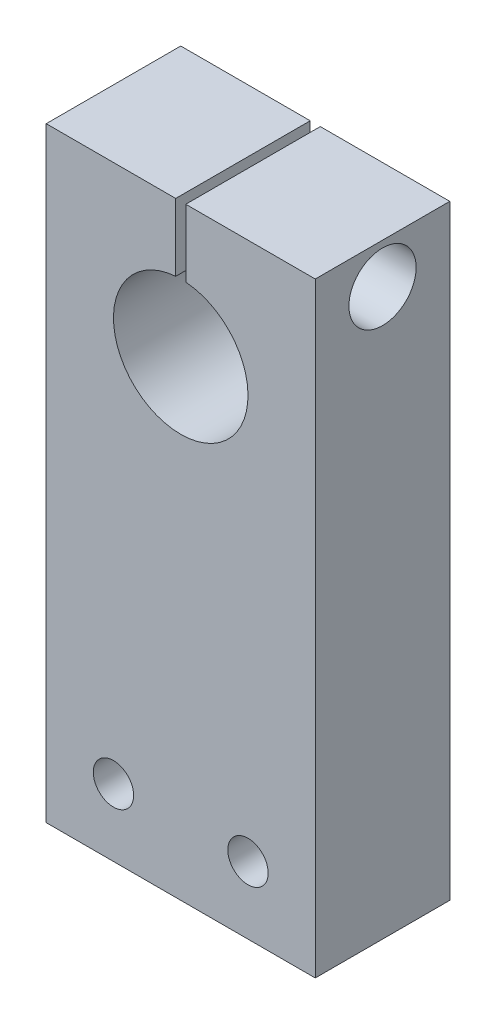
ISO-10303-21;
HEADER;
FILE_DESCRIPTION(('STEP AP214'),'2;1');
FILE_NAME('part.step','',(''),(''),'','','');
FILE_SCHEMA(('AUTOMOTIVE_DESIGN { 1 0 10303 214 1 1 1 1 }'));
ENDSEC;
DATA;
#1=APPLICATION_CONTEXT('core data for automotive mechanical design processes');
#2=APPLICATION_PROTOCOL_DEFINITION('international standard','automotive_design',2000,#1);
#3=PRODUCT_CONTEXT('',#1,'mechanical');
#4=PRODUCT('Part','Part','',(#3));
#5=PRODUCT_RELATED_PRODUCT_CATEGORY('part','',(#4));
#6=PRODUCT_DEFINITION_FORMATION('','',#4);
#7=PRODUCT_DEFINITION_CONTEXT('part definition',#1,'design');
#8=PRODUCT_DEFINITION('design','',#6,#7);
#9=PRODUCT_DEFINITION_SHAPE('','',#8);
#10=(LENGTH_UNIT() NAMED_UNIT(*) SI_UNIT(.MILLI.,.METRE.));
#11=(NAMED_UNIT(*) PLANE_ANGLE_UNIT() SI_UNIT($,.RADIAN.));
#12=(NAMED_UNIT(*) SI_UNIT($,.STERADIAN.) SOLID_ANGLE_UNIT());
#13=UNCERTAINTY_MEASURE_WITH_UNIT(LENGTH_MEASURE(1.E-05),#10,'distance_accuracy_value','');
#14=(GEOMETRIC_REPRESENTATION_CONTEXT(3) GLOBAL_UNCERTAINTY_ASSIGNED_CONTEXT((#13)) GLOBAL_UNIT_ASSIGNED_CONTEXT((#10,
#11,#12)) REPRESENTATION_CONTEXT('',''));
#15=CARTESIAN_POINT('',(0.,0.,0.));
#16=DIRECTION('',(0.,0.,1.));
#17=DIRECTION('',(1.,0.,0.));
#18=AXIS2_PLACEMENT_3D('',#15,#16,#17);
#19=CARTESIAN_POINT('',(-9.99999999999999,39.,10.));
#20=DIRECTION('',(1.,0.,0.));
#21=DIRECTION('',(0.,0.,-1.));
#22=AXIS2_PLACEMENT_3D('',#19,#20,#21);
#23=CYLINDRICAL_SURFACE('',#22,3.);
#24=CARTESIAN_POINT('',(0.750000000000001,39.,10.));
#25=DIRECTION('',(1.,0.,0.));
#26=DIRECTION('',(0.,1.,0.));
#27=AXIS2_PLACEMENT_3D('',#24,#25,#26);
#28=CIRCLE('',#27,3.);
#29=CARTESIAN_POINT('',(0.750000000000001,42.,10.));
#30=VERTEX_POINT('',#29);
#31=EDGE_CURVE('E141',#30,#30,#28,.T.);
#32=ORIENTED_EDGE('',*,*,#31,.F.);
#33=EDGE_LOOP('',(#32));
#34=FACE_BOUND('',#33,.T.);
#35=CARTESIAN_POINT('',(10.,39.,10.));
#36=DIRECTION('',(1.,0.,0.));
#37=DIRECTION('',(0.,0.,-1.));
#38=AXIS2_PLACEMENT_3D('',#35,#36,#37);
#39=CIRCLE('',#38,3.);
#40=CARTESIAN_POINT('',(10.,39.,7.));
#41=VERTEX_POINT('',#40);
#42=EDGE_CURVE('E39',#41,#41,#39,.F.);
#43=ORIENTED_EDGE('',*,*,#42,.F.);
#44=EDGE_LOOP('',(#43));
#45=FACE_BOUND('',#44,.T.);
#46=ADVANCED_FACE('F35',(#34,#45),#23,.F.);
#47=CARTESIAN_POINT('',(0.,25.,20.));
#48=DIRECTION('',(0.,0.,-1.));
#49=DIRECTION('',(-1.,0.,0.));
#50=AXIS2_PLACEMENT_3D('',#47,#48,#49);
#51=CYLINDRICAL_SURFACE('',#50,10.);
#52=CARTESIAN_POINT('',(0.,25.,0.));
#53=DIRECTION('',(0.,0.,1.));
#54=DIRECTION('',(1.,0.,0.));
#55=AXIS2_PLACEMENT_3D('',#52,#53,#54);
#56=CIRCLE('',#55,10.);
#57=CARTESIAN_POINT('',(-0.75,34.9718353375896,0.));
#58=VERTEX_POINT('',#57);
#59=CARTESIAN_POINT('',(0.75,34.9718353375896,0.));
#60=VERTEX_POINT('',#59);
#61=EDGE_CURVE('E183',#58,#60,#56,.T.);
#62=ORIENTED_EDGE('',*,*,#61,.F.);
#63=DIRECTION('',(0.,0.,-1.));
#64=VECTOR('',#63,1.);
#65=CARTESIAN_POINT('',(-0.75,34.9718353375896,20.));
#66=LINE('',#65,#64);
#67=CARTESIAN_POINT('',(-0.75,34.9718353375896,20.));
#68=VERTEX_POINT('',#67);
#69=EDGE_CURVE('E11',#68,#58,#66,.T.);
#70=ORIENTED_EDGE('',*,*,#69,.F.);
#71=CARTESIAN_POINT('',(0.,25.,20.));
#72=DIRECTION('',(0.,0.,1.));
#73=DIRECTION('',(1.,0.,0.));
#74=AXIS2_PLACEMENT_3D('',#71,#72,#73);
#75=CIRCLE('',#74,10.);
#76=CARTESIAN_POINT('',(0.75,34.9718353375896,20.));
#77=VERTEX_POINT('',#76);
#78=EDGE_CURVE('E166',#68,#77,#75,.T.);
#79=ORIENTED_EDGE('',*,*,#78,.T.);
#80=DIRECTION('',(0.,0.,-1.));
#81=VECTOR('',#80,1.);
#82=CARTESIAN_POINT('',(0.75,34.9718353375896,20.));
#83=LINE('',#82,#81);
#84=EDGE_CURVE('E88',#77,#60,#83,.T.);
#85=ORIENTED_EDGE('',*,*,#84,.T.);
#86=EDGE_LOOP('',(#62,#70,#79,#85));
#87=FACE_BOUND('',#86,.T.);
#88=ADVANCED_FACE('F204',(#87),#51,.F.);
#89=CARTESIAN_POINT('',(-0.749999999999999,0.,20.));
#90=DIRECTION('',(-1.,0.,0.));
#91=DIRECTION('',(0.,-1.,0.));
#92=AXIS2_PLACEMENT_3D('',#89,#90,#91);
#93=PLANE('',#92);
#94=CARTESIAN_POINT('',(-0.750000000000001,39.,10.));
#95=DIRECTION('',(-1.,0.,0.));
#96=DIRECTION('',(0.,-1.,0.));
#97=AXIS2_PLACEMENT_3D('',#94,#95,#96);
#98=CIRCLE('',#97,3.);
#99=CARTESIAN_POINT('',(-0.750000000000001,36.,10.));
#100=VERTEX_POINT('',#99);
#101=EDGE_CURVE('E143',#100,#100,#98,.T.);
#102=ORIENTED_EDGE('',*,*,#101,.T.);
#103=EDGE_LOOP('',(#102));
#104=FACE_BOUND('',#103,.T.);
#105=DIRECTION('',(0.,1.,0.));
#106=VECTOR('',#105,1.);
#107=CARTESIAN_POINT('',(-0.749999999999999,0.,0.));
#108=LINE('',#107,#106);
#109=CARTESIAN_POINT('',(-0.75,45.,0.));
#110=VERTEX_POINT('',#109);
#111=EDGE_CURVE('E185',#58,#110,#108,.T.);
#112=ORIENTED_EDGE('',*,*,#111,.T.);
#113=DIRECTION('',(0.,0.,-1.));
#114=VECTOR('',#113,1.);
#115=CARTESIAN_POINT('',(-0.75,45.,20.));
#116=LINE('',#115,#114);
#117=CARTESIAN_POINT('',(-0.75,45.,20.));
#118=VERTEX_POINT('',#117);
#119=EDGE_CURVE('E45',#118,#110,#116,.T.);
#120=ORIENTED_EDGE('',*,*,#119,.F.);
#121=DIRECTION('',(0.,1.,0.));
#122=VECTOR('',#121,1.);
#123=CARTESIAN_POINT('',(-0.749999999999999,0.,20.));
#124=LINE('',#123,#122);
#125=EDGE_CURVE('E168',#68,#118,#124,.T.);
#126=ORIENTED_EDGE('',*,*,#125,.F.);
#127=ORIENTED_EDGE('',*,*,#69,.T.);
#128=EDGE_LOOP('',(#112,#120,#126,#127));
#129=FACE_BOUND('',#128,.T.);
#130=ADVANCED_FACE('F206',(#104,#129),#93,.F.);
#131=CARTESIAN_POINT('',(0.,45.,20.));
#132=DIRECTION('',(0.,-1.,0.));
#133=DIRECTION('',(0.,0.,-1.));
#134=AXIS2_PLACEMENT_3D('',#131,#132,#133);
#135=PLANE('',#134);
#136=DIRECTION('',(-1.,0.,0.));
#137=VECTOR('',#136,1.);
#138=CARTESIAN_POINT('',(0.,45.,0.));
#139=LINE('',#138,#137);
#140=CARTESIAN_POINT('',(-20.,45.,0.));
#141=VERTEX_POINT('',#140);
#142=EDGE_CURVE('E188',#110,#141,#139,.T.);
#143=ORIENTED_EDGE('',*,*,#142,.T.);
#144=DIRECTION('',(0.,0.,-1.));
#145=VECTOR('',#144,1.);
#146=CARTESIAN_POINT('',(-20.,45.,20.));
#147=LINE('',#146,#145);
#148=CARTESIAN_POINT('',(-20.,45.,20.));
#149=VERTEX_POINT('',#148);
#150=EDGE_CURVE('E137',#149,#141,#147,.T.);
#151=ORIENTED_EDGE('',*,*,#150,.F.);
#152=DIRECTION('',(-1.,0.,0.));
#153=VECTOR('',#152,1.);
#154=CARTESIAN_POINT('',(0.,45.,20.));
#155=LINE('',#154,#153);
#156=EDGE_CURVE('E171',#118,#149,#155,.T.);
#157=ORIENTED_EDGE('',*,*,#156,.F.);
#158=ORIENTED_EDGE('',*,*,#119,.T.);
#159=EDGE_LOOP('',(#143,#151,#157,#158));
#160=FACE_BOUND('',#159,.T.);
#161=ADVANCED_FACE('F212',(#160),#135,.F.);
#162=CARTESIAN_POINT('',(-20.,0.,20.));
#163=DIRECTION('',(1.,0.,0.));
#164=DIRECTION('',(0.,0.,-1.));
#165=AXIS2_PLACEMENT_3D('',#162,#163,#164);
#166=PLANE('',#165);
#167=DIRECTION('',(0.,-1.,0.));
#168=VECTOR('',#167,1.);
#169=CARTESIAN_POINT('',(-20.,0.,0.));
#170=LINE('',#169,#168);
#171=CARTESIAN_POINT('',(-20.,-45.,0.));
#172=VERTEX_POINT('',#171);
#173=EDGE_CURVE('E191',#141,#172,#170,.T.);
#174=ORIENTED_EDGE('',*,*,#173,.T.);
#175=DIRECTION('',(0.,0.,-1.));
#176=VECTOR('',#175,1.);
#177=CARTESIAN_POINT('',(-20.,-45.,20.));
#178=LINE('',#177,#176);
#179=CARTESIAN_POINT('',(-20.,-45.,20.));
#180=VERTEX_POINT('',#179);
#181=EDGE_CURVE('E130',#180,#172,#178,.T.);
#182=ORIENTED_EDGE('',*,*,#181,.F.);
#183=DIRECTION('',(0.,-1.,0.));
#184=VECTOR('',#183,1.);
#185=CARTESIAN_POINT('',(-20.,0.,20.));
#186=LINE('',#185,#184);
#187=EDGE_CURVE('E174',#149,#180,#186,.T.);
#188=ORIENTED_EDGE('',*,*,#187,.F.);
#189=ORIENTED_EDGE('',*,*,#150,.T.);
#190=EDGE_LOOP('',(#174,#182,#188,#189));
#191=FACE_BOUND('',#190,.T.);
#192=ADVANCED_FACE('F252',(#191),#166,.F.);
#193=CARTESIAN_POINT('',(0.,-45.,20.));
#194=DIRECTION('',(0.,1.,0.));
#195=DIRECTION('',(0.,0.,1.));
#196=AXIS2_PLACEMENT_3D('',#193,#194,#195);
#197=PLANE('',#196);
#198=DIRECTION('',(1.,0.,0.));
#199=VECTOR('',#198,1.);
#200=CARTESIAN_POINT('',(0.,-45.,0.));
#201=LINE('',#200,#199);
#202=CARTESIAN_POINT('',(20.,-45.,0.));
#203=VERTEX_POINT('',#202);
#204=EDGE_CURVE('E194',#172,#203,#201,.T.);
#205=ORIENTED_EDGE('',*,*,#204,.T.);
#206=DIRECTION('',(0.,0.,-1.));
#207=VECTOR('',#206,1.);
#208=CARTESIAN_POINT('',(20.,-45.,20.));
#209=LINE('',#208,#207);
#210=CARTESIAN_POINT('',(20.,-45.,20.));
#211=VERTEX_POINT('',#210);
#212=EDGE_CURVE('E128',#211,#203,#209,.T.);
#213=ORIENTED_EDGE('',*,*,#212,.F.);
#214=DIRECTION('',(1.,0.,0.));
#215=VECTOR('',#214,1.);
#216=CARTESIAN_POINT('',(0.,-45.,20.));
#217=LINE('',#216,#215);
#218=EDGE_CURVE('E121',#180,#211,#217,.T.);
#219=ORIENTED_EDGE('',*,*,#218,.F.);
#220=ORIENTED_EDGE('',*,*,#181,.T.);
#221=EDGE_LOOP('',(#205,#213,#219,#220));
#222=FACE_BOUND('',#221,.T.);
#223=ADVANCED_FACE('F248',(#222),#197,.F.);
#224=CARTESIAN_POINT('',(20.,0.,20.));
#225=DIRECTION('',(-1.,0.,0.));
#226=DIRECTION('',(0.,0.,1.));
#227=AXIS2_PLACEMENT_3D('',#224,#225,#226);
#228=PLANE('',#227);
#229=CARTESIAN_POINT('',(20.,39.,10.));
#230=DIRECTION('',(1.,0.,0.));
#231=DIRECTION('',(0.,0.,-1.));
#232=AXIS2_PLACEMENT_3D('',#229,#230,#231);
#233=CIRCLE('',#232,5.);
#234=CARTESIAN_POINT('',(20.,39.,5.));
#235=VERTEX_POINT('',#234);
#236=EDGE_CURVE('E157',#235,#235,#233,.T.);
#237=ORIENTED_EDGE('',*,*,#236,.F.);
#238=EDGE_LOOP('',(#237));
#239=FACE_BOUND('',#238,.T.);
#240=DIRECTION('',(0.,1.,0.));
#241=VECTOR('',#240,1.);
#242=CARTESIAN_POINT('',(20.,0.,0.));
#243=LINE('',#242,#241);
#244=CARTESIAN_POINT('',(20.,45.,0.));
#245=VERTEX_POINT('',#244);
#246=EDGE_CURVE('E127',#203,#245,#243,.T.);
#247=ORIENTED_EDGE('',*,*,#246,.T.);
#248=DIRECTION('',(0.,0.,-1.));
#249=VECTOR('',#248,1.);
#250=CARTESIAN_POINT('',(20.,45.,20.));
#251=LINE('',#250,#249);
#252=CARTESIAN_POINT('',(20.,45.,20.));
#253=VERTEX_POINT('',#252);
#254=EDGE_CURVE('E113',#253,#245,#251,.T.);
#255=ORIENTED_EDGE('',*,*,#254,.F.);
#256=DIRECTION('',(0.,1.,0.));
#257=VECTOR('',#256,1.);
#258=CARTESIAN_POINT('',(20.,0.,20.));
#259=LINE('',#258,#257);
#260=EDGE_CURVE('E116',#211,#253,#259,.T.);
#261=ORIENTED_EDGE('',*,*,#260,.F.);
#262=ORIENTED_EDGE('',*,*,#212,.T.);
#263=EDGE_LOOP('',(#247,#255,#261,#262));
#264=FACE_BOUND('',#263,.T.);
#265=ADVANCED_FACE('F126',(#239,#264),#228,.F.);
#266=CARTESIAN_POINT('',(0.,45.,20.));
#267=DIRECTION('',(0.,-1.,0.));
#268=DIRECTION('',(0.,0.,-1.));
#269=AXIS2_PLACEMENT_3D('',#266,#267,#268);
#270=PLANE('',#269);
#271=DIRECTION('',(-1.,0.,0.));
#272=VECTOR('',#271,1.);
#273=CARTESIAN_POINT('',(0.,45.,0.));
#274=LINE('',#273,#272);
#275=CARTESIAN_POINT('',(0.75,45.,0.));
#276=VERTEX_POINT('',#275);
#277=EDGE_CURVE('E198',#245,#276,#274,.T.);
#278=ORIENTED_EDGE('',*,*,#277,.T.);
#279=DIRECTION('',(0.,0.,-1.));
#280=VECTOR('',#279,1.);
#281=CARTESIAN_POINT('',(0.75,45.,20.));
#282=LINE('',#281,#280);
#283=CARTESIAN_POINT('',(0.75,45.,20.));
#284=VERTEX_POINT('',#283);
#285=EDGE_CURVE('E115',#284,#276,#282,.T.);
#286=ORIENTED_EDGE('',*,*,#285,.F.);
#287=DIRECTION('',(-1.,0.,0.));
#288=VECTOR('',#287,1.);
#289=CARTESIAN_POINT('',(0.,45.,20.));
#290=LINE('',#289,#288);
#291=EDGE_CURVE('E108',#253,#284,#290,.T.);
#292=ORIENTED_EDGE('',*,*,#291,.F.);
#293=ORIENTED_EDGE('',*,*,#254,.T.);
#294=EDGE_LOOP('',(#278,#286,#292,#293));
#295=FACE_BOUND('',#294,.T.);
#296=ADVANCED_FACE('F111',(#295),#270,.F.);
#297=CARTESIAN_POINT('',(-10.,-35.,20.));
#298=DIRECTION('',(0.,0.,-1.));
#299=DIRECTION('',(-1.,0.,0.));
#300=AXIS2_PLACEMENT_3D('',#297,#298,#299);
#301=CYLINDRICAL_SURFACE('',#300,3.);
#302=CARTESIAN_POINT('',(-10.,-35.,20.));
#303=DIRECTION('',(0.,0.,1.));
#304=DIRECTION('',(1.,0.,0.));
#305=AXIS2_PLACEMENT_3D('',#302,#303,#304);
#306=CIRCLE('',#305,3.);
#307=CARTESIAN_POINT('',(-7.,-35.,20.));
#308=VERTEX_POINT('',#307);
#309=EDGE_CURVE('E163',#308,#308,#306,.T.);
#310=ORIENTED_EDGE('',*,*,#309,.T.);
#311=EDGE_LOOP('',(#310));
#312=FACE_BOUND('',#311,.T.);
#313=CARTESIAN_POINT('',(-10.,-35.,0.));
#314=DIRECTION('',(0.,0.,1.));
#315=DIRECTION('',(1.,0.,0.));
#316=AXIS2_PLACEMENT_3D('',#313,#314,#315);
#317=CIRCLE('',#316,3.);
#318=CARTESIAN_POINT('',(-7.,-35.,0.));
#319=VERTEX_POINT('',#318);
#320=EDGE_CURVE('E180',#319,#319,#317,.T.);
#321=ORIENTED_EDGE('',*,*,#320,.F.);
#322=EDGE_LOOP('',(#321));
#323=FACE_BOUND('',#322,.T.);
#324=ADVANCED_FACE('F219',(#312,#323),#301,.F.);
#325=CARTESIAN_POINT('',(10.,-35.,20.));
#326=DIRECTION('',(0.,0.,-1.));
#327=DIRECTION('',(-1.,0.,0.));
#328=AXIS2_PLACEMENT_3D('',#325,#326,#327);
#329=CYLINDRICAL_SURFACE('',#328,3.);
#330=CARTESIAN_POINT('',(10.,-35.,20.));
#331=DIRECTION('',(0.,0.,1.));
#332=DIRECTION('',(1.,0.,0.));
#333=AXIS2_PLACEMENT_3D('',#330,#331,#332);
#334=CIRCLE('',#333,3.);
#335=CARTESIAN_POINT('',(13.,-35.,20.));
#336=VERTEX_POINT('',#335);
#337=EDGE_CURVE('E160',#336,#336,#334,.T.);
#338=ORIENTED_EDGE('',*,*,#337,.T.);
#339=EDGE_LOOP('',(#338));
#340=FACE_BOUND('',#339,.T.);
#341=CARTESIAN_POINT('',(10.,-35.,0.));
#342=DIRECTION('',(0.,0.,1.));
#343=DIRECTION('',(1.,0.,0.));
#344=AXIS2_PLACEMENT_3D('',#341,#342,#343);
#345=CIRCLE('',#344,3.);
#346=CARTESIAN_POINT('',(13.,-35.,0.));
#347=VERTEX_POINT('',#346);
#348=EDGE_CURVE('E148',#347,#347,#345,.T.);
#349=ORIENTED_EDGE('',*,*,#348,.F.);
#350=EDGE_LOOP('',(#349));
#351=FACE_BOUND('',#350,.T.);
#352=ADVANCED_FACE('F37',(#340,#351),#329,.F.);
#353=CARTESIAN_POINT('',(0.749999999999999,0.,20.));
#354=DIRECTION('',(1.,0.,0.));
#355=DIRECTION('',(0.,1.,0.));
#356=AXIS2_PLACEMENT_3D('',#353,#354,#355);
#357=PLANE('',#356);
#358=ORIENTED_EDGE('',*,*,#31,.T.);
#359=EDGE_LOOP('',(#358));
#360=FACE_BOUND('',#359,.T.);
#361=DIRECTION('',(0.,-1.,0.));
#362=VECTOR('',#361,1.);
#363=CARTESIAN_POINT('',(0.749999999999999,0.,0.));
#364=LINE('',#363,#362);
#365=EDGE_CURVE('E81',#276,#60,#364,.T.);
#366=ORIENTED_EDGE('',*,*,#365,.T.);
#367=ORIENTED_EDGE('',*,*,#84,.F.);
#368=DIRECTION('',(0.,-1.,0.));
#369=VECTOR('',#368,1.);
#370=CARTESIAN_POINT('',(0.749999999999999,0.,20.));
#371=LINE('',#370,#369);
#372=EDGE_CURVE('E54',#284,#77,#371,.T.);
#373=ORIENTED_EDGE('',*,*,#372,.F.);
#374=ORIENTED_EDGE('',*,*,#285,.T.);
#375=EDGE_LOOP('',(#366,#367,#373,#374));
#376=FACE_BOUND('',#375,.T.);
#377=ADVANCED_FACE('F201',(#360,#376),#357,.F.);
#378=CARTESIAN_POINT('',(0.,0.,20.));
#379=DIRECTION('',(0.,0.,1.));
#380=DIRECTION('',(1.,0.,0.));
#381=AXIS2_PLACEMENT_3D('',#378,#379,#380);
#382=PLANE('',#381);
#383=ORIENTED_EDGE('',*,*,#337,.F.);
#384=EDGE_LOOP('',(#383));
#385=FACE_BOUND('',#384,.T.);
#386=ORIENTED_EDGE('',*,*,#309,.F.);
#387=EDGE_LOOP('',(#386));
#388=FACE_BOUND('',#387,.T.);
#389=ORIENTED_EDGE('',*,*,#78,.F.);
#390=ORIENTED_EDGE('',*,*,#125,.T.);
#391=ORIENTED_EDGE('',*,*,#156,.T.);
#392=ORIENTED_EDGE('',*,*,#187,.T.);
#393=ORIENTED_EDGE('',*,*,#218,.T.);
#394=ORIENTED_EDGE('',*,*,#260,.T.);
#395=ORIENTED_EDGE('',*,*,#291,.T.);
#396=ORIENTED_EDGE('',*,*,#372,.T.);
#397=EDGE_LOOP('',(#389,#390,#391,#392,#393,#394,#395,#396));
#398=FACE_BOUND('',#397,.T.);
#399=ADVANCED_FACE('F119',(#385,#388,#398),#382,.T.);
#400=CARTESIAN_POINT('',(0.,0.,0.));
#401=DIRECTION('',(0.,0.,1.));
#402=DIRECTION('',(1.,0.,0.));
#403=AXIS2_PLACEMENT_3D('',#400,#401,#402);
#404=PLANE('',#403);
#405=ORIENTED_EDGE('',*,*,#348,.T.);
#406=EDGE_LOOP('',(#405));
#407=FACE_BOUND('',#406,.T.);
#408=ORIENTED_EDGE('',*,*,#320,.T.);
#409=EDGE_LOOP('',(#408));
#410=FACE_BOUND('',#409,.T.);
#411=ORIENTED_EDGE('',*,*,#61,.T.);
#412=ORIENTED_EDGE('',*,*,#365,.F.);
#413=ORIENTED_EDGE('',*,*,#277,.F.);
#414=ORIENTED_EDGE('',*,*,#246,.F.);
#415=ORIENTED_EDGE('',*,*,#204,.F.);
#416=ORIENTED_EDGE('',*,*,#173,.F.);
#417=ORIENTED_EDGE('',*,*,#142,.F.);
#418=ORIENTED_EDGE('',*,*,#111,.F.);
#419=EDGE_LOOP('',(#411,#412,#413,#414,#415,#416,#417,#418));
#420=FACE_BOUND('',#419,.T.);
#421=ADVANCED_FACE('F203',(#407,#410,#420),#404,.F.);
#422=CARTESIAN_POINT('',(-9.99999999999999,39.,10.));
#423=DIRECTION('',(1.,0.,0.));
#424=DIRECTION('',(0.,0.,-1.));
#425=AXIS2_PLACEMENT_3D('',#422,#423,#424);
#426=CIRCLE('',#425,3.);
#427=CARTESIAN_POINT('',(-9.99999999999999,39.,7.));
#428=VERTEX_POINT('',#427);
#429=EDGE_CURVE('E144',#428,#428,#426,.T.);
#430=ORIENTED_EDGE('',*,*,#429,.F.);
#431=EDGE_LOOP('',(#430));
#432=FACE_BOUND('',#431,.T.);
#433=ORIENTED_EDGE('',*,*,#101,.F.);
#434=EDGE_LOOP('',(#433));
#435=FACE_BOUND('',#434,.T.);
#436=ADVANCED_FACE('F217',(#432,#435),#23,.F.);
#437=CARTESIAN_POINT('',(-9.99999999999999,39.,10.));
#438=DIRECTION('',(1.,0.,0.));
#439=DIRECTION('',(0.,0.,-1.));
#440=AXIS2_PLACEMENT_3D('',#437,#438,#439);
#441=PLANE('',#440);
#442=ORIENTED_EDGE('',*,*,#429,.T.);
#443=EDGE_LOOP('',(#442));
#444=FACE_BOUND('',#443,.T.);
#445=ADVANCED_FACE('F239',(#444),#441,.T.);
#446=CARTESIAN_POINT('',(10.,39.,10.));
#447=DIRECTION('',(1.,0.,0.));
#448=DIRECTION('',(0.,0.,-1.));
#449=AXIS2_PLACEMENT_3D('',#446,#447,#448);
#450=PLANE('',#449);
#451=CARTESIAN_POINT('',(10.,39.,10.));
#452=DIRECTION('',(1.,0.,0.));
#453=DIRECTION('',(0.,0.,-1.));
#454=AXIS2_PLACEMENT_3D('',#451,#452,#453);
#455=CIRCLE('',#454,5.);
#456=CARTESIAN_POINT('',(10.,39.,5.));
#457=VERTEX_POINT('',#456);
#458=EDGE_CURVE('E155',#457,#457,#455,.T.);
#459=ORIENTED_EDGE('',*,*,#458,.T.);
#460=EDGE_LOOP('',(#459));
#461=FACE_BOUND('',#460,.T.);
#462=ORIENTED_EDGE('',*,*,#42,.T.);
#463=EDGE_LOOP('',(#462));
#464=FACE_BOUND('',#463,.T.);
#465=ADVANCED_FACE('F329',(#461,#464),#450,.T.);
#466=CARTESIAN_POINT('',(10.,39.,10.));
#467=DIRECTION('',(1.,0.,0.));
#468=DIRECTION('',(0.,0.,-1.));
#469=AXIS2_PLACEMENT_3D('',#466,#467,#468);
#470=CYLINDRICAL_SURFACE('',#469,5.);
#471=ORIENTED_EDGE('',*,*,#458,.F.);
#472=EDGE_LOOP('',(#471));
#473=FACE_BOUND('',#472,.T.);
#474=ORIENTED_EDGE('',*,*,#236,.T.);
#475=EDGE_LOOP('',(#474));
#476=FACE_BOUND('',#475,.T.);
#477=ADVANCED_FACE('F344',(#473,#476),#470,.F.);
#478=CLOSED_SHELL('',(#46,#88,#130,#161,#192,#223,#265,#296,#324,#352,#377,#399,#421,#436,#445,
#465,#477));
#479=MANIFOLD_SOLID_BREP('B2',#478);
#480=ADVANCED_BREP_SHAPE_REPRESENTATION('',(#18,#479),#14);
#481=SHAPE_DEFINITION_REPRESENTATION(#9,#480);
ENDSEC;
END-ISO-10303-21;
